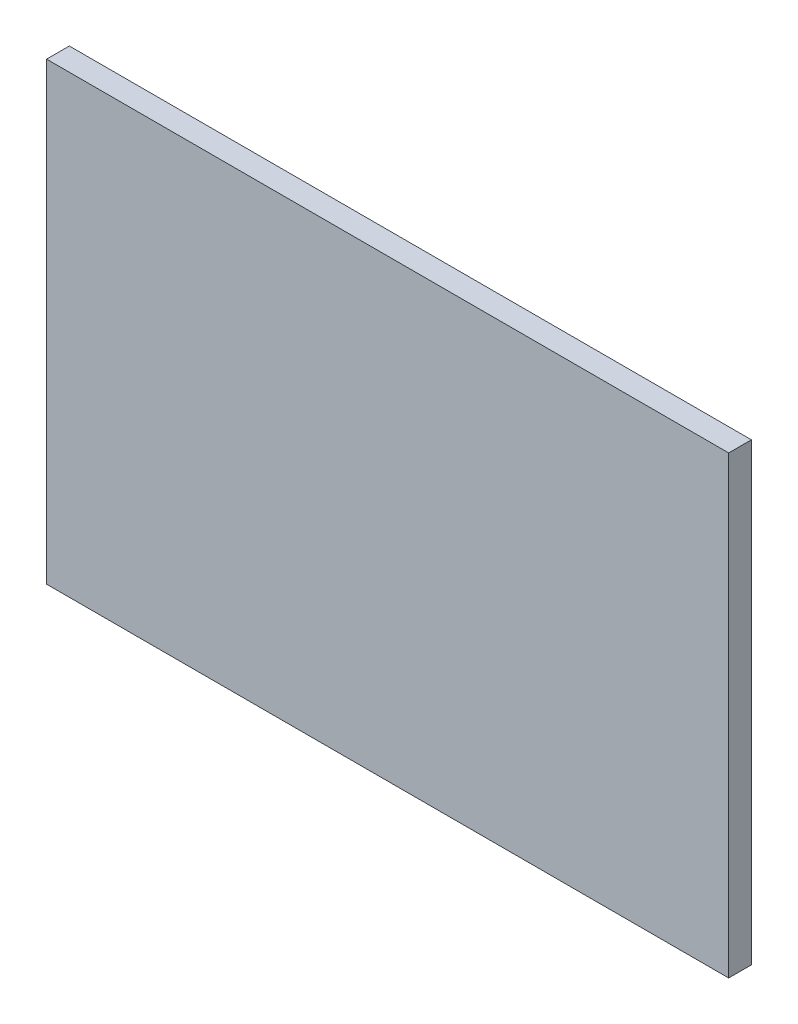
ISO-10303-21;
HEADER;
FILE_DESCRIPTION(('STEP AP214'),'2;1');
FILE_NAME('part.step','',(''),(''),'','','');
FILE_SCHEMA(('AUTOMOTIVE_DESIGN { 1 0 10303 214 1 1 1 1 }'));
ENDSEC;
DATA;
#1=APPLICATION_CONTEXT('core data for automotive mechanical design processes');
#2=APPLICATION_PROTOCOL_DEFINITION('international standard','automotive_design',2000,#1);
#3=PRODUCT_CONTEXT('',#1,'mechanical');
#4=PRODUCT('Part','Part','',(#3));
#5=PRODUCT_RELATED_PRODUCT_CATEGORY('part','',(#4));
#6=PRODUCT_DEFINITION_FORMATION('','',#4);
#7=PRODUCT_DEFINITION_CONTEXT('part definition',#1,'design');
#8=PRODUCT_DEFINITION('design','',#6,#7);
#9=PRODUCT_DEFINITION_SHAPE('','',#8);
#10=(LENGTH_UNIT() NAMED_UNIT(*) SI_UNIT(.MILLI.,.METRE.));
#11=(NAMED_UNIT(*) PLANE_ANGLE_UNIT() SI_UNIT($,.RADIAN.));
#12=(NAMED_UNIT(*) SI_UNIT($,.STERADIAN.) SOLID_ANGLE_UNIT());
#13=UNCERTAINTY_MEASURE_WITH_UNIT(LENGTH_MEASURE(1.E-05),#10,'distance_accuracy_value','');
#14=(GEOMETRIC_REPRESENTATION_CONTEXT(3) GLOBAL_UNCERTAINTY_ASSIGNED_CONTEXT((#13)) GLOBAL_UNIT_ASSIGNED_CONTEXT((#10,
#11,#12)) REPRESENTATION_CONTEXT('',''));
#15=CARTESIAN_POINT('',(0.,0.,0.));
#16=DIRECTION('',(0.,0.,1.));
#17=DIRECTION('',(1.,0.,0.));
#18=AXIS2_PLACEMENT_3D('',#15,#16,#17);
#19=CARTESIAN_POINT('',(41.229997558594,45.758999023437,1.1723000001));
#20=DIRECTION('',(0.,0.,1.));
#21=DIRECTION('',(1.,0.,0.));
#22=AXIS2_PLACEMENT_3D('',#19,#20,#21);
#23=PLANE('',#22);
#24=DIRECTION('',(0.,-1.,0.));
#25=VECTOR('',#24,1.);
#26=CARTESIAN_POINT('',(41.039497070313,45.631997070312,1.1723000001));
#27=LINE('',#26,#25);
#28=CARTESIAN_POINT('',(41.039497070313,45.886000976562,1.1723000001));
#29=VERTEX_POINT('',#28);
#30=CARTESIAN_POINT('',(41.039497070313,45.631997070312,1.1723000001));
#31=VERTEX_POINT('',#30);
#32=EDGE_CURVE('E21',#29,#31,#27,.T.);
#33=ORIENTED_EDGE('',*,*,#32,.T.);
#34=DIRECTION('',(1.,0.,0.));
#35=VECTOR('',#34,1.);
#36=CARTESIAN_POINT('',(41.420498046875,45.631997070312,1.1723000001));
#37=LINE('',#36,#35);
#38=CARTESIAN_POINT('',(41.420498046875,45.631997070312,1.1723000001));
#39=VERTEX_POINT('',#38);
#40=EDGE_CURVE('E70',#31,#39,#37,.T.);
#41=ORIENTED_EDGE('',*,*,#40,.T.);
#42=DIRECTION('',(0.,1.,0.));
#43=VECTOR('',#42,1.);
#44=CARTESIAN_POINT('',(41.420498046875,45.886000976562,1.1723000001));
#45=LINE('',#44,#43);
#46=CARTESIAN_POINT('',(41.420498046875,45.886000976562,1.1723000001));
#47=VERTEX_POINT('',#46);
#48=EDGE_CURVE('E77',#39,#47,#45,.T.);
#49=ORIENTED_EDGE('',*,*,#48,.T.);
#50=DIRECTION('',(-1.,0.,0.));
#51=VECTOR('',#50,1.);
#52=CARTESIAN_POINT('',(41.039497070313,45.886000976562,1.1723000001));
#53=LINE('',#52,#51);
#54=EDGE_CURVE('E11',#47,#29,#53,.T.);
#55=ORIENTED_EDGE('',*,*,#54,.T.);
#56=EDGE_LOOP('',(#33,#41,#49,#55));
#57=FACE_BOUND('',#56,.T.);
#58=ADVANCED_FACE('F17',(#57),#23,.T.);
#59=CARTESIAN_POINT('',(41.039497070313,45.886000976562,1.1596000001));
#60=DIRECTION('',(0.,-1.,0.));
#61=DIRECTION('',(0.,0.,-1.));
#62=AXIS2_PLACEMENT_3D('',#59,#60,#61);
#63=PLANE('',#62);
#64=DIRECTION('',(0.,0.,-1.));
#65=VECTOR('',#64,1.);
#66=CARTESIAN_POINT('',(41.420498046875,45.886000976562,1.1596000001));
#67=LINE('',#66,#65);
#68=CARTESIAN_POINT('',(41.420498046875,45.886000976562,1.1596000001));
#69=VERTEX_POINT('',#68);
#70=EDGE_CURVE('E64',#47,#69,#67,.T.);
#71=ORIENTED_EDGE('',*,*,#70,.T.);
#72=DIRECTION('',(-1.,0.,0.));
#73=VECTOR('',#72,1.);
#74=CARTESIAN_POINT('',(41.229997558594,45.886000976562,1.1596000001));
#75=LINE('',#74,#73);
#76=CARTESIAN_POINT('',(41.039497070313,45.886000976562,1.1596000001));
#77=VERTEX_POINT('',#76);
#78=EDGE_CURVE('E98',#69,#77,#75,.T.);
#79=ORIENTED_EDGE('',*,*,#78,.T.);
#80=DIRECTION('',(0.,0.,1.));
#81=VECTOR('',#80,1.);
#82=CARTESIAN_POINT('',(41.039497070313,45.886000976562,1.1596000001));
#83=LINE('',#82,#81);
#84=EDGE_CURVE('E76',#77,#29,#83,.T.);
#85=ORIENTED_EDGE('',*,*,#84,.T.);
#86=ORIENTED_EDGE('',*,*,#54,.F.);
#87=EDGE_LOOP('',(#71,#79,#85,#86));
#88=FACE_BOUND('',#87,.T.);
#89=ADVANCED_FACE('F75',(#88),#63,.F.);
#90=CARTESIAN_POINT('',(41.039497070313,45.631997070312,1.1596000001));
#91=DIRECTION('',(1.,0.,0.));
#92=DIRECTION('',(0.,1.,0.));
#93=AXIS2_PLACEMENT_3D('',#90,#91,#92);
#94=PLANE('',#93);
#95=ORIENTED_EDGE('',*,*,#84,.F.);
#96=DIRECTION('',(0.,-1.,0.));
#97=VECTOR('',#96,1.);
#98=CARTESIAN_POINT('',(41.039497070313,45.758999023437,1.1596000001));
#99=LINE('',#98,#97);
#100=CARTESIAN_POINT('',(41.039497070313,45.631997070312,1.1596000001));
#101=VERTEX_POINT('',#100);
#102=EDGE_CURVE('E113',#77,#101,#99,.T.);
#103=ORIENTED_EDGE('',*,*,#102,.T.);
#104=DIRECTION('',(0.,0.,1.));
#105=VECTOR('',#104,1.);
#106=CARTESIAN_POINT('',(41.039497070313,45.631997070312,1.1596000001));
#107=LINE('',#106,#105);
#108=EDGE_CURVE('E81',#101,#31,#107,.T.);
#109=ORIENTED_EDGE('',*,*,#108,.T.);
#110=ORIENTED_EDGE('',*,*,#32,.F.);
#111=EDGE_LOOP('',(#95,#103,#109,#110));
#112=FACE_BOUND('',#111,.T.);
#113=ADVANCED_FACE('F126',(#112),#94,.F.);
#114=CARTESIAN_POINT('',(41.420498046875,45.631997070312,1.1596000001));
#115=DIRECTION('',(0.,1.,0.));
#116=DIRECTION('',(1.,0.,0.));
#117=AXIS2_PLACEMENT_3D('',#114,#115,#116);
#118=PLANE('',#117);
#119=ORIENTED_EDGE('',*,*,#108,.F.);
#120=DIRECTION('',(1.,0.,0.));
#121=VECTOR('',#120,1.);
#122=CARTESIAN_POINT('',(41.229997558594,45.631997070312,1.1596000001));
#123=LINE('',#122,#121);
#124=CARTESIAN_POINT('',(41.420498046875,45.631997070312,1.1596000001));
#125=VERTEX_POINT('',#124);
#126=EDGE_CURVE('E115',#101,#125,#123,.T.);
#127=ORIENTED_EDGE('',*,*,#126,.T.);
#128=DIRECTION('',(0.,0.,1.));
#129=VECTOR('',#128,1.);
#130=CARTESIAN_POINT('',(41.420498046875,45.631997070312,1.1596000001));
#131=LINE('',#130,#129);
#132=EDGE_CURVE('E88',#125,#39,#131,.T.);
#133=ORIENTED_EDGE('',*,*,#132,.T.);
#134=ORIENTED_EDGE('',*,*,#40,.F.);
#135=EDGE_LOOP('',(#119,#127,#133,#134));
#136=FACE_BOUND('',#135,.T.);
#137=ADVANCED_FACE('F123',(#136),#118,.F.);
#138=CARTESIAN_POINT('',(41.420498046875,45.886000976562,1.1596000001));
#139=DIRECTION('',(-1.,0.,0.));
#140=DIRECTION('',(0.,0.,1.));
#141=AXIS2_PLACEMENT_3D('',#138,#139,#140);
#142=PLANE('',#141);
#143=ORIENTED_EDGE('',*,*,#132,.F.);
#144=DIRECTION('',(0.,1.,0.));
#145=VECTOR('',#144,1.);
#146=CARTESIAN_POINT('',(41.420498046875,45.758999023437,1.1596000001));
#147=LINE('',#146,#145);
#148=EDGE_CURVE('E85',#125,#69,#147,.T.);
#149=ORIENTED_EDGE('',*,*,#148,.T.);
#150=ORIENTED_EDGE('',*,*,#70,.F.);
#151=ORIENTED_EDGE('',*,*,#48,.F.);
#152=EDGE_LOOP('',(#143,#149,#150,#151));
#153=FACE_BOUND('',#152,.T.);
#154=ADVANCED_FACE('F83',(#153),#142,.F.);
#155=CARTESIAN_POINT('',(41.229997558594,45.758999023437,1.1596000001));
#156=DIRECTION('',(0.,0.,1.));
#157=DIRECTION('',(1.,0.,0.));
#158=AXIS2_PLACEMENT_3D('',#155,#156,#157);
#159=PLANE('',#158);
#160=ORIENTED_EDGE('',*,*,#126,.F.);
#161=ORIENTED_EDGE('',*,*,#102,.F.);
#162=ORIENTED_EDGE('',*,*,#78,.F.);
#163=ORIENTED_EDGE('',*,*,#148,.F.);
#164=EDGE_LOOP('',(#160,#161,#162,#163));
#165=FACE_BOUND('',#164,.T.);
#166=ADVANCED_FACE('F19',(#165),#159,.F.);
#167=CLOSED_SHELL('',(#58,#89,#113,#137,#154,#166));
#168=MANIFOLD_SOLID_BREP('B1',#167);
#169=ADVANCED_BREP_SHAPE_REPRESENTATION('',(#18,#168),#14);
#170=SHAPE_DEFINITION_REPRESENTATION(#9,#169);
ENDSEC;
END-ISO-10303-21;
